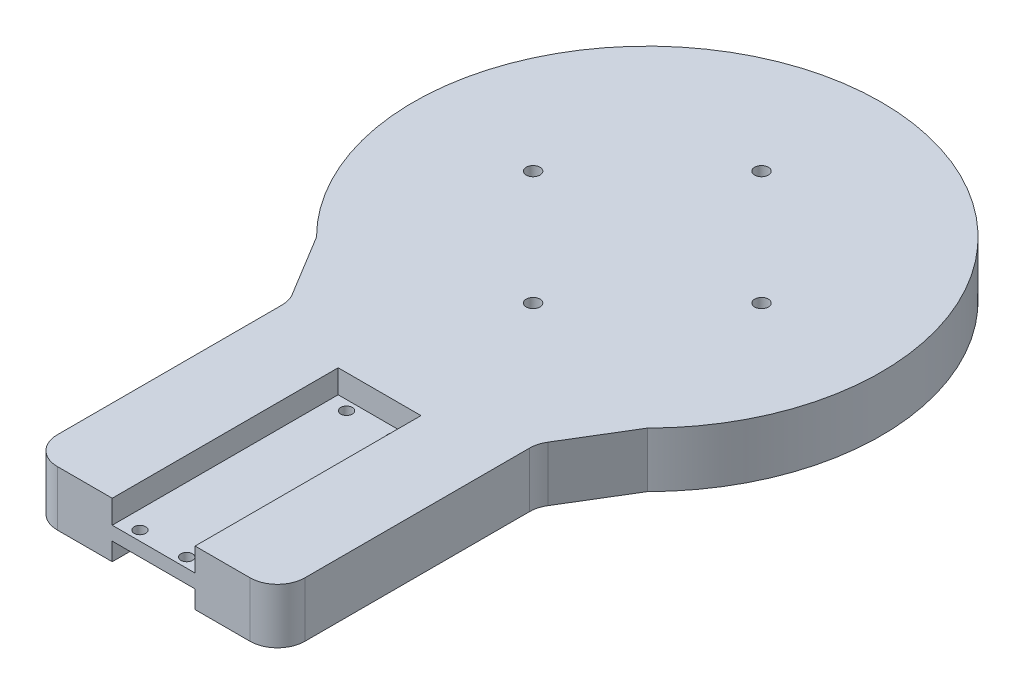
ISO-10303-21;
HEADER;
FILE_DESCRIPTION(('STEP AP214'),'2;1');
FILE_NAME('part.step','',(''),(''),'','','');
FILE_SCHEMA(('AUTOMOTIVE_DESIGN { 1 0 10303 214 1 1 1 1 }'));
ENDSEC;
DATA;
#1=APPLICATION_CONTEXT('core data for automotive mechanical design processes');
#2=APPLICATION_PROTOCOL_DEFINITION('international standard','automotive_design',2000,#1);
#3=PRODUCT_CONTEXT('',#1,'mechanical');
#4=PRODUCT('Part','Part','',(#3));
#5=PRODUCT_RELATED_PRODUCT_CATEGORY('part','',(#4));
#6=PRODUCT_DEFINITION_FORMATION('','',#4);
#7=PRODUCT_DEFINITION_CONTEXT('part definition',#1,'design');
#8=PRODUCT_DEFINITION('design','',#6,#7);
#9=PRODUCT_DEFINITION_SHAPE('','',#8);
#10=(LENGTH_UNIT() NAMED_UNIT(*) SI_UNIT(.MILLI.,.METRE.));
#11=(NAMED_UNIT(*) PLANE_ANGLE_UNIT() SI_UNIT($,.RADIAN.));
#12=(NAMED_UNIT(*) SI_UNIT($,.STERADIAN.) SOLID_ANGLE_UNIT());
#13=UNCERTAINTY_MEASURE_WITH_UNIT(LENGTH_MEASURE(1.E-05),#10,'distance_accuracy_value','');
#14=(GEOMETRIC_REPRESENTATION_CONTEXT(3) GLOBAL_UNCERTAINTY_ASSIGNED_CONTEXT((#13)) GLOBAL_UNIT_ASSIGNED_CONTEXT((#10,
#11,#12)) REPRESENTATION_CONTEXT('',''));
#15=CARTESIAN_POINT('',(0.,0.,0.));
#16=DIRECTION('',(0.,0.,1.));
#17=DIRECTION('',(1.,0.,0.));
#18=AXIS2_PLACEMENT_3D('',#15,#16,#17);
#19=CARTESIAN_POINT('',(35.,20.,169.39));
#20=DIRECTION('',(0.,1.,0.));
#21=DIRECTION('',(0.,0.,1.));
#22=AXIS2_PLACEMENT_3D('',#19,#20,#21);
#23=PLANE('',#22);
#24=DIRECTION('',(0.,0.,-1.));
#25=VECTOR('',#24,1.);
#26=CARTESIAN_POINT('',(15.05,20.,97.29));
#27=LINE('',#26,#25);
#28=CARTESIAN_POINT('',(15.05,20.,179.39));
#29=VERTEX_POINT('',#28);
#30=CARTESIAN_POINT('',(15.05,20.,97.29));
#31=VERTEX_POINT('',#30);
#32=EDGE_CURVE('E211',#29,#31,#27,.T.);
#33=ORIENTED_EDGE('',*,*,#32,.F.);
#34=DIRECTION('',(1.,0.,0.));
#35=VECTOR('',#34,1.);
#36=CARTESIAN_POINT('',(-34.9999999999999,20.,179.39));
#37=LINE('',#36,#35);
#38=CARTESIAN_POINT('',(34.9999999999999,20.,179.39));
#39=VERTEX_POINT('',#38);
#40=EDGE_CURVE('E315',#29,#39,#37,.T.);
#41=ORIENTED_EDGE('',*,*,#40,.T.);
#42=CARTESIAN_POINT('',(35.,20.,169.39));
#43=DIRECTION('',(0.,1.,0.));
#44=DIRECTION('',(0.,0.,1.));
#45=AXIS2_PLACEMENT_3D('',#42,#43,#44);
#46=CIRCLE('',#45,10.);
#47=CARTESIAN_POINT('',(45.,20.,169.39));
#48=VERTEX_POINT('',#47);
#49=EDGE_CURVE('E286',#39,#48,#46,.T.);
#50=ORIENTED_EDGE('',*,*,#49,.T.);
#51=DIRECTION('',(0.,0.,-1.));
#52=VECTOR('',#51,1.);
#53=CARTESIAN_POINT('',(45.,20.,169.39));
#54=LINE('',#53,#52);
#55=CARTESIAN_POINT('',(45.,20.,87.7962570863811));
#56=VERTEX_POINT('',#55);
#57=EDGE_CURVE('E290',#48,#56,#54,.T.);
#58=ORIENTED_EDGE('',*,*,#57,.T.);
#59=CARTESIAN_POINT('',(55.,20.,87.7962570863811));
#60=DIRECTION('',(0.,-1.,0.));
#61=DIRECTION('',(0.,0.,-1.));
#62=AXIS2_PLACEMENT_3D('',#59,#60,#61);
#63=CIRCLE('',#62,10.);
#64=CARTESIAN_POINT('',(46.4504029529679,20.,82.6093128671534));
#65=VERTEX_POINT('',#64);
#66=EDGE_CURVE('E294',#56,#65,#63,.T.);
#67=ORIENTED_EDGE('',*,*,#66,.T.);
#68=DIRECTION('',(0.518694421922767,0.,-0.854959704703214));
#69=VECTOR('',#68,1.);
#70=CARTESIAN_POINT('',(60.1040764008566,20.,60.1040764008565));
#71=LINE('',#70,#69);
#72=CARTESIAN_POINT('',(60.1040764008565,20.,60.1040764008565));
#73=VERTEX_POINT('',#72);
#74=EDGE_CURVE('E297',#65,#73,#71,.T.);
#75=ORIENTED_EDGE('',*,*,#74,.T.);
#76=CARTESIAN_POINT('',(0.,20.,0.));
#77=DIRECTION('',(0.,1.,0.));
#78=DIRECTION('',(0.,0.,1.));
#79=AXIS2_PLACEMENT_3D('',#76,#77,#78);
#80=CIRCLE('',#79,85.);
#81=CARTESIAN_POINT('',(-60.1040764008565,20.,60.1040764008565));
#82=VERTEX_POINT('',#81);
#83=EDGE_CURVE('E300',#73,#82,#80,.T.);
#84=ORIENTED_EDGE('',*,*,#83,.T.);
#85=DIRECTION('',(0.518694421922766,0.,0.854959704703215));
#86=VECTOR('',#85,1.);
#87=CARTESIAN_POINT('',(-60.1040764008565,20.,60.1040764008565));
#88=LINE('',#87,#86);
#89=CARTESIAN_POINT('',(-46.4504029529679,20.,82.6093128671534));
#90=VERTEX_POINT('',#89);
#91=EDGE_CURVE('E303',#82,#90,#88,.T.);
#92=ORIENTED_EDGE('',*,*,#91,.T.);
#93=CARTESIAN_POINT('',(-55.,20.,87.7962570863811));
#94=DIRECTION('',(0.,-1.,0.));
#95=DIRECTION('',(0.,0.,1.));
#96=AXIS2_PLACEMENT_3D('',#93,#94,#95);
#97=CIRCLE('',#96,10.);
#98=CARTESIAN_POINT('',(-45.,20.,87.7962570863811));
#99=VERTEX_POINT('',#98);
#100=EDGE_CURVE('E306',#90,#99,#97,.T.);
#101=ORIENTED_EDGE('',*,*,#100,.T.);
#102=DIRECTION('',(0.,0.,1.));
#103=VECTOR('',#102,1.);
#104=CARTESIAN_POINT('',(-45.,20.,87.7962570863811));
#105=LINE('',#104,#103);
#106=CARTESIAN_POINT('',(-45.,20.,169.39));
#107=VERTEX_POINT('',#106);
#108=EDGE_CURVE('E309',#99,#107,#105,.T.);
#109=ORIENTED_EDGE('',*,*,#108,.T.);
#110=CARTESIAN_POINT('',(-35.,20.,169.39));
#111=DIRECTION('',(0.,1.,0.));
#112=DIRECTION('',(0.,0.,1.));
#113=AXIS2_PLACEMENT_3D('',#110,#111,#112);
#114=CIRCLE('',#113,10.);
#115=CARTESIAN_POINT('',(-34.9999999999999,20.,179.39));
#116=VERTEX_POINT('',#115);
#117=EDGE_CURVE('E312',#107,#116,#114,.T.);
#118=ORIENTED_EDGE('',*,*,#117,.T.);
#119=CARTESIAN_POINT('',(-15.05,20.,179.39));
#120=VERTEX_POINT('',#119);
#121=EDGE_CURVE('E316',#116,#120,#37,.T.);
#122=ORIENTED_EDGE('',*,*,#121,.T.);
#123=DIRECTION('',(0.,0.,1.));
#124=VECTOR('',#123,1.);
#125=CARTESIAN_POINT('',(-15.05,20.,97.29));
#126=LINE('',#125,#124);
#127=CARTESIAN_POINT('',(-15.05,20.,97.29));
#128=VERTEX_POINT('',#127);
#129=EDGE_CURVE('E223',#128,#120,#126,.T.);
#130=ORIENTED_EDGE('',*,*,#129,.F.);
#131=DIRECTION('',(-1.,0.,0.));
#132=VECTOR('',#131,1.);
#133=CARTESIAN_POINT('',(-15.05,20.,97.29));
#134=LINE('',#133,#132);
#135=EDGE_CURVE('E235',#31,#128,#134,.T.);
#136=ORIENTED_EDGE('',*,*,#135,.F.);
#137=EDGE_LOOP('',(#33,#41,#50,#58,#67,#75,#84,#92,#101,#109,#118,#122,#130,#136));
#138=FACE_BOUND('',#137,.T.);
#139=CARTESIAN_POINT('',(2.35196016362844E-12,20.,41.5));
#140=DIRECTION('',(0.,1.,0.));
#141=DIRECTION('',(0.,0.,1.));
#142=AXIS2_PLACEMENT_3D('',#139,#140,#141);
#143=CIRCLE('',#142,2.50000000000253);
#144=CARTESIAN_POINT('',(2.35196016362844E-12,20.,44.0000000000025));
#145=VERTEX_POINT('',#144);
#146=EDGE_CURVE('E262',#145,#145,#143,.T.);
#147=ORIENTED_EDGE('',*,*,#146,.F.);
#148=EDGE_LOOP('',(#147));
#149=FACE_BOUND('',#148,.T.);
#150=CARTESIAN_POINT('',(0.,20.,-41.5));
#151=DIRECTION('',(0.,1.,0.));
#152=DIRECTION('',(0.,0.,1.));
#153=AXIS2_PLACEMENT_3D('',#150,#151,#152);
#154=CIRCLE('',#153,2.5);
#155=CARTESIAN_POINT('',(0.,20.,-39.));
#156=VERTEX_POINT('',#155);
#157=EDGE_CURVE('E278',#156,#156,#154,.T.);
#158=ORIENTED_EDGE('',*,*,#157,.F.);
#159=EDGE_LOOP('',(#158));
#160=FACE_BOUND('',#159,.T.);
#161=CARTESIAN_POINT('',(41.5000000000012,20.,-1.17598008181422E-12));
#162=DIRECTION('',(0.,1.,0.));
#163=DIRECTION('',(0.,0.,1.));
#164=AXIS2_PLACEMENT_3D('',#161,#162,#163);
#165=CIRCLE('',#164,2.50000000000092);
#166=CARTESIAN_POINT('',(41.5000000000012,20.,2.49999999999974));
#167=VERTEX_POINT('',#166);
#168=EDGE_CURVE('E270',#167,#167,#165,.T.);
#169=ORIENTED_EDGE('',*,*,#168,.F.);
#170=EDGE_LOOP('',(#169));
#171=FACE_BOUND('',#170,.T.);
#172=CARTESIAN_POINT('',(-41.4999999999988,20.,1.18106236603068E-12));
#173=DIRECTION('',(0.,1.,0.));
#174=DIRECTION('',(0.,0.,1.));
#175=AXIS2_PLACEMENT_3D('',#172,#173,#174);
#176=CIRCLE('',#175,2.50000000000189);
#177=CARTESIAN_POINT('',(-41.4999999999988,20.,2.50000000000307));
#178=VERTEX_POINT('',#177);
#179=EDGE_CURVE('E254',#178,#178,#176,.T.);
#180=ORIENTED_EDGE('',*,*,#179,.F.);
#181=EDGE_LOOP('',(#180));
#182=FACE_BOUND('',#181,.T.);
#183=ADVANCED_FACE('F39',(#138,#149,#160,#171,#182),#23,.T.);
#184=CARTESIAN_POINT('',(35.,0.,169.39));
#185=DIRECTION('',(0.,1.,0.));
#186=DIRECTION('',(0.,0.,1.));
#187=AXIS2_PLACEMENT_3D('',#184,#185,#186);
#188=PLANE('',#187);
#189=DIRECTION('',(1.,0.,0.));
#190=VECTOR('',#189,1.);
#191=CARTESIAN_POINT('',(-15.05,0.,97.29));
#192=LINE('',#191,#190);
#193=CARTESIAN_POINT('',(-15.05,0.,97.29));
#194=VERTEX_POINT('',#193);
#195=CARTESIAN_POINT('',(15.05,0.,97.29));
#196=VERTEX_POINT('',#195);
#197=EDGE_CURVE('E193',#194,#196,#192,.T.);
#198=ORIENTED_EDGE('',*,*,#197,.F.);
#199=DIRECTION('',(0.,0.,-1.));
#200=VECTOR('',#199,1.);
#201=CARTESIAN_POINT('',(-15.05,0.,179.39));
#202=LINE('',#201,#200);
#203=CARTESIAN_POINT('',(-15.05,0.,179.39));
#204=VERTEX_POINT('',#203);
#205=EDGE_CURVE('E174',#204,#194,#202,.T.);
#206=ORIENTED_EDGE('',*,*,#205,.F.);
#207=DIRECTION('',(1.,0.,0.));
#208=VECTOR('',#207,1.);
#209=CARTESIAN_POINT('',(-34.9999999999999,0.,179.39));
#210=LINE('',#209,#208);
#211=CARTESIAN_POINT('',(-34.9999999999999,0.,179.39));
#212=VERTEX_POINT('',#211);
#213=EDGE_CURVE('E291',#212,#204,#210,.T.);
#214=ORIENTED_EDGE('',*,*,#213,.F.);
#215=CARTESIAN_POINT('',(-35.,0.,169.39));
#216=DIRECTION('',(0.,1.,0.));
#217=DIRECTION('',(0.,0.,1.));
#218=AXIS2_PLACEMENT_3D('',#215,#216,#217);
#219=CIRCLE('',#218,10.);
#220=CARTESIAN_POINT('',(-45.,0.,169.39));
#221=VERTEX_POINT('',#220);
#222=EDGE_CURVE('E346',#221,#212,#219,.T.);
#223=ORIENTED_EDGE('',*,*,#222,.F.);
#224=DIRECTION('',(0.,0.,1.));
#225=VECTOR('',#224,1.);
#226=CARTESIAN_POINT('',(-45.,0.,118.89));
#227=LINE('',#226,#225);
#228=CARTESIAN_POINT('',(-45.,0.,87.7962570863811));
#229=VERTEX_POINT('',#228);
#230=EDGE_CURVE('E343',#229,#221,#227,.T.);
#231=ORIENTED_EDGE('',*,*,#230,.F.);
#232=CARTESIAN_POINT('',(-55.,0.,87.7962570863811));
#233=DIRECTION('',(0.,-1.,0.));
#234=DIRECTION('',(0.,0.,1.));
#235=AXIS2_PLACEMENT_3D('',#232,#233,#234);
#236=CIRCLE('',#235,10.);
#237=CARTESIAN_POINT('',(-46.4504029529679,0.,82.6093128671534));
#238=VERTEX_POINT('',#237);
#239=EDGE_CURVE('E339',#238,#229,#236,.T.);
#240=ORIENTED_EDGE('',*,*,#239,.F.);
#241=DIRECTION('',(0.518694421922766,0.,0.854959704703215));
#242=VECTOR('',#241,1.);
#243=CARTESIAN_POINT('',(-60.1040764008565,0.,60.1040764008565));
#244=LINE('',#243,#242);
#245=CARTESIAN_POINT('',(-60.1040764008565,0.,60.1040764008565));
#246=VERTEX_POINT('',#245);
#247=EDGE_CURVE('E336',#246,#238,#244,.T.);
#248=ORIENTED_EDGE('',*,*,#247,.F.);
#249=CARTESIAN_POINT('',(0.,0.,0.));
#250=DIRECTION('',(0.,1.,0.));
#251=DIRECTION('',(0.,0.,1.));
#252=AXIS2_PLACEMENT_3D('',#249,#250,#251);
#253=CIRCLE('',#252,85.);
#254=CARTESIAN_POINT('',(60.1040764008565,0.,60.1040764008565));
#255=VERTEX_POINT('',#254);
#256=EDGE_CURVE('E333',#255,#246,#253,.T.);
#257=ORIENTED_EDGE('',*,*,#256,.F.);
#258=DIRECTION('',(0.518694421922767,0.,-0.854959704703214));
#259=VECTOR('',#258,1.);
#260=CARTESIAN_POINT('',(60.1040764008566,0.,60.1040764008565));
#261=LINE('',#260,#259);
#262=CARTESIAN_POINT('',(46.4504029529679,0.,82.6093128671534));
#263=VERTEX_POINT('',#262);
#264=EDGE_CURVE('E330',#263,#255,#261,.T.);
#265=ORIENTED_EDGE('',*,*,#264,.F.);
#266=CARTESIAN_POINT('',(55.,0.,87.7962570863811));
#267=DIRECTION('',(0.,-1.,0.));
#268=DIRECTION('',(0.,0.,-1.));
#269=AXIS2_PLACEMENT_3D('',#266,#267,#268);
#270=CIRCLE('',#269,10.);
#271=CARTESIAN_POINT('',(45.,0.,87.7962570863811));
#272=VERTEX_POINT('',#271);
#273=EDGE_CURVE('E327',#272,#263,#270,.T.);
#274=ORIENTED_EDGE('',*,*,#273,.F.);
#275=DIRECTION('',(0.,0.,-1.));
#276=VECTOR('',#275,1.);
#277=CARTESIAN_POINT('',(45.,0.,87.7962570863811));
#278=LINE('',#277,#276);
#279=CARTESIAN_POINT('',(45.,0.,169.39));
#280=VERTEX_POINT('',#279);
#281=EDGE_CURVE('E324',#280,#272,#278,.T.);
#282=ORIENTED_EDGE('',*,*,#281,.F.);
#283=CARTESIAN_POINT('',(35.,0.,169.39));
#284=DIRECTION('',(0.,1.,0.));
#285=DIRECTION('',(0.,0.,1.));
#286=AXIS2_PLACEMENT_3D('',#283,#284,#285);
#287=CIRCLE('',#286,10.);
#288=CARTESIAN_POINT('',(34.9999999999999,0.,179.39));
#289=VERTEX_POINT('',#288);
#290=EDGE_CURVE('E282',#289,#280,#287,.T.);
#291=ORIENTED_EDGE('',*,*,#290,.F.);
#292=CARTESIAN_POINT('',(15.05,0.,179.39));
#293=VERTEX_POINT('',#292);
#294=EDGE_CURVE('E349',#293,#289,#210,.T.);
#295=ORIENTED_EDGE('',*,*,#294,.F.);
#296=DIRECTION('',(0.,0.,1.));
#297=VECTOR('',#296,1.);
#298=CARTESIAN_POINT('',(15.05,0.,97.29));
#299=LINE('',#298,#297);
#300=EDGE_CURVE('E190',#196,#293,#299,.T.);
#301=ORIENTED_EDGE('',*,*,#300,.F.);
#302=EDGE_LOOP('',(#198,#206,#214,#223,#231,#240,#248,#257,#265,#274,#282,#291,#295,#301));
#303=FACE_BOUND('',#302,.T.);
#304=CARTESIAN_POINT('',(0.,0.,-41.5));
#305=DIRECTION('',(0.,1.,0.));
#306=DIRECTION('',(0.,0.,1.));
#307=AXIS2_PLACEMENT_3D('',#304,#305,#306);
#308=CIRCLE('',#307,2.5);
#309=CARTESIAN_POINT('',(0.,0.,-39.));
#310=VERTEX_POINT('',#309);
#311=EDGE_CURVE('E274',#310,#310,#308,.T.);
#312=ORIENTED_EDGE('',*,*,#311,.T.);
#313=EDGE_LOOP('',(#312));
#314=FACE_BOUND('',#313,.T.);
#315=CARTESIAN_POINT('',(41.5000000000012,0.,-1.17598008181422E-12));
#316=DIRECTION('',(0.,1.,0.));
#317=DIRECTION('',(0.,0.,1.));
#318=AXIS2_PLACEMENT_3D('',#315,#316,#317);
#319=CIRCLE('',#318,2.50000000000092);
#320=CARTESIAN_POINT('',(41.5000000000012,0.,2.49999999999974));
#321=VERTEX_POINT('',#320);
#322=EDGE_CURVE('E266',#321,#321,#319,.T.);
#323=ORIENTED_EDGE('',*,*,#322,.T.);
#324=EDGE_LOOP('',(#323));
#325=FACE_BOUND('',#324,.T.);
#326=CARTESIAN_POINT('',(2.35196016362844E-12,0.,41.5));
#327=DIRECTION('',(0.,1.,0.));
#328=DIRECTION('',(0.,0.,1.));
#329=AXIS2_PLACEMENT_3D('',#326,#327,#328);
#330=CIRCLE('',#329,2.50000000000253);
#331=CARTESIAN_POINT('',(2.35196016362844E-12,0.,44.0000000000025));
#332=VERTEX_POINT('',#331);
#333=EDGE_CURVE('E258',#332,#332,#330,.T.);
#334=ORIENTED_EDGE('',*,*,#333,.T.);
#335=EDGE_LOOP('',(#334));
#336=FACE_BOUND('',#335,.T.);
#337=CARTESIAN_POINT('',(-41.4999999999988,0.,1.18106236603068E-12));
#338=DIRECTION('',(0.,1.,0.));
#339=DIRECTION('',(0.,0.,1.));
#340=AXIS2_PLACEMENT_3D('',#337,#338,#339);
#341=CIRCLE('',#340,2.50000000000189);
#342=CARTESIAN_POINT('',(-41.4999999999988,0.,2.50000000000307));
#343=VERTEX_POINT('',#342);
#344=EDGE_CURVE('E244',#343,#343,#341,.T.);
#345=ORIENTED_EDGE('',*,*,#344,.T.);
#346=EDGE_LOOP('',(#345));
#347=FACE_BOUND('',#346,.T.);
#348=ADVANCED_FACE('F394',(#303,#314,#325,#336,#347),#188,.F.);
#349=CARTESIAN_POINT('',(35.,20.,169.39));
#350=DIRECTION('',(0.,-1.,0.));
#351=DIRECTION('',(0.,0.,-1.));
#352=AXIS2_PLACEMENT_3D('',#349,#350,#351);
#353=CYLINDRICAL_SURFACE('',#352,10.);
#354=ORIENTED_EDGE('',*,*,#290,.T.);
#355=DIRECTION('',(0.,-1.,0.));
#356=VECTOR('',#355,1.);
#357=CARTESIAN_POINT('',(45.,20.,169.39));
#358=LINE('',#357,#356);
#359=EDGE_CURVE('E11',#48,#280,#358,.T.);
#360=ORIENTED_EDGE('',*,*,#359,.F.);
#361=ORIENTED_EDGE('',*,*,#49,.F.);
#362=DIRECTION('',(0.,-1.,0.));
#363=VECTOR('',#362,1.);
#364=CARTESIAN_POINT('',(34.9999999999999,20.,179.39));
#365=LINE('',#364,#363);
#366=EDGE_CURVE('E320',#39,#289,#365,.T.);
#367=ORIENTED_EDGE('',*,*,#366,.T.);
#368=EDGE_LOOP('',(#354,#360,#361,#367));
#369=FACE_BOUND('',#368,.T.);
#370=ADVANCED_FACE('F41',(#369),#353,.T.);
#371=CARTESIAN_POINT('',(45.,20.,87.7962570863811));
#372=DIRECTION('',(-1.,0.,0.));
#373=DIRECTION('',(0.,0.,1.));
#374=AXIS2_PLACEMENT_3D('',#371,#372,#373);
#375=PLANE('',#374);
#376=ORIENTED_EDGE('',*,*,#281,.T.);
#377=DIRECTION('',(0.,-1.,0.));
#378=VECTOR('',#377,1.);
#379=CARTESIAN_POINT('',(45.,20.,87.7962570863811));
#380=LINE('',#379,#378);
#381=EDGE_CURVE('E48',#56,#272,#380,.T.);
#382=ORIENTED_EDGE('',*,*,#381,.F.);
#383=ORIENTED_EDGE('',*,*,#57,.F.);
#384=ORIENTED_EDGE('',*,*,#359,.T.);
#385=EDGE_LOOP('',(#376,#382,#383,#384));
#386=FACE_BOUND('',#385,.T.);
#387=ADVANCED_FACE('F414',(#386),#375,.F.);
#388=CARTESIAN_POINT('',(55.,20.,87.7962570863811));
#389=DIRECTION('',(0.,-1.,0.));
#390=DIRECTION('',(0.,0.,-1.));
#391=AXIS2_PLACEMENT_3D('',#388,#389,#390);
#392=CYLINDRICAL_SURFACE('',#391,10.);
#393=ORIENTED_EDGE('',*,*,#273,.T.);
#394=DIRECTION('',(0.,-1.,0.));
#395=VECTOR('',#394,1.);
#396=CARTESIAN_POINT('',(46.4504029529679,20.,82.6093128671534));
#397=LINE('',#396,#395);
#398=EDGE_CURVE('E380',#65,#263,#397,.T.);
#399=ORIENTED_EDGE('',*,*,#398,.F.);
#400=ORIENTED_EDGE('',*,*,#66,.F.);
#401=ORIENTED_EDGE('',*,*,#381,.T.);
#402=EDGE_LOOP('',(#393,#399,#400,#401));
#403=FACE_BOUND('',#402,.T.);
#404=ADVANCED_FACE('F389',(#403),#392,.F.);
#405=CARTESIAN_POINT('',(60.1040764008566,20.,60.1040764008565));
#406=DIRECTION('',(-0.854959704703214,0.,-0.518694421922767));
#407=DIRECTION('',(-0.518694421922767,0.,0.854959704703214));
#408=AXIS2_PLACEMENT_3D('',#405,#406,#407);
#409=PLANE('',#408);
#410=ORIENTED_EDGE('',*,*,#264,.T.);
#411=DIRECTION('',(0.,-1.,0.));
#412=VECTOR('',#411,1.);
#413=CARTESIAN_POINT('',(60.1040764008565,20.,60.1040764008565));
#414=LINE('',#413,#412);
#415=EDGE_CURVE('E376',#73,#255,#414,.T.);
#416=ORIENTED_EDGE('',*,*,#415,.F.);
#417=ORIENTED_EDGE('',*,*,#74,.F.);
#418=ORIENTED_EDGE('',*,*,#398,.T.);
#419=EDGE_LOOP('',(#410,#416,#417,#418));
#420=FACE_BOUND('',#419,.T.);
#421=ADVANCED_FACE('F401',(#420),#409,.F.);
#422=CARTESIAN_POINT('',(0.,20.,0.));
#423=DIRECTION('',(0.,-1.,0.));
#424=DIRECTION('',(0.,0.,-1.));
#425=AXIS2_PLACEMENT_3D('',#422,#423,#424);
#426=CYLINDRICAL_SURFACE('',#425,85.);
#427=ORIENTED_EDGE('',*,*,#256,.T.);
#428=DIRECTION('',(0.,-1.,0.));
#429=VECTOR('',#428,1.);
#430=CARTESIAN_POINT('',(-60.1040764008565,20.,60.1040764008565));
#431=LINE('',#430,#429);
#432=EDGE_CURVE('E372',#82,#246,#431,.T.);
#433=ORIENTED_EDGE('',*,*,#432,.F.);
#434=ORIENTED_EDGE('',*,*,#83,.F.);
#435=ORIENTED_EDGE('',*,*,#415,.T.);
#436=EDGE_LOOP('',(#427,#433,#434,#435));
#437=FACE_BOUND('',#436,.T.);
#438=ADVANCED_FACE('F405',(#437),#426,.T.);
#439=CARTESIAN_POINT('',(-60.1040764008565,20.,60.1040764008565));
#440=DIRECTION('',(0.854959704703215,0.,-0.518694421922766));
#441=DIRECTION('',(-0.518694421922766,0.,-0.854959704703215));
#442=AXIS2_PLACEMENT_3D('',#439,#440,#441);
#443=PLANE('',#442);
#444=ORIENTED_EDGE('',*,*,#247,.T.);
#445=DIRECTION('',(0.,-1.,0.));
#446=VECTOR('',#445,1.);
#447=CARTESIAN_POINT('',(-46.4504029529679,20.,82.6093128671534));
#448=LINE('',#447,#446);
#449=EDGE_CURVE('E368',#90,#238,#448,.T.);
#450=ORIENTED_EDGE('',*,*,#449,.F.);
#451=ORIENTED_EDGE('',*,*,#91,.F.);
#452=ORIENTED_EDGE('',*,*,#432,.T.);
#453=EDGE_LOOP('',(#444,#450,#451,#452));
#454=FACE_BOUND('',#453,.T.);
#455=ADVANCED_FACE('F558',(#454),#443,.F.);
#456=CARTESIAN_POINT('',(-55.,20.,87.7962570863811));
#457=DIRECTION('',(0.,-1.,0.));
#458=DIRECTION('',(0.,0.,-1.));
#459=AXIS2_PLACEMENT_3D('',#456,#457,#458);
#460=CYLINDRICAL_SURFACE('',#459,10.);
#461=ORIENTED_EDGE('',*,*,#239,.T.);
#462=DIRECTION('',(0.,-1.,0.));
#463=VECTOR('',#462,1.);
#464=CARTESIAN_POINT('',(-45.,20.,87.7962570863811));
#465=LINE('',#464,#463);
#466=EDGE_CURVE('E364',#99,#229,#465,.T.);
#467=ORIENTED_EDGE('',*,*,#466,.F.);
#468=ORIENTED_EDGE('',*,*,#100,.F.);
#469=ORIENTED_EDGE('',*,*,#449,.T.);
#470=EDGE_LOOP('',(#461,#467,#468,#469));
#471=FACE_BOUND('',#470,.T.);
#472=ADVANCED_FACE('F551',(#471),#460,.F.);
#473=CARTESIAN_POINT('',(-45.,20.,118.89));
#474=DIRECTION('',(1.,0.,0.));
#475=DIRECTION('',(0.,0.,-1.));
#476=AXIS2_PLACEMENT_3D('',#473,#474,#475);
#477=PLANE('',#476);
#478=ORIENTED_EDGE('',*,*,#230,.T.);
#479=DIRECTION('',(0.,-1.,0.));
#480=VECTOR('',#479,1.);
#481=CARTESIAN_POINT('',(-45.,20.,169.39));
#482=LINE('',#481,#480);
#483=EDGE_CURVE('E360',#107,#221,#482,.T.);
#484=ORIENTED_EDGE('',*,*,#483,.F.);
#485=ORIENTED_EDGE('',*,*,#108,.F.);
#486=ORIENTED_EDGE('',*,*,#466,.T.);
#487=EDGE_LOOP('',(#478,#484,#485,#486));
#488=FACE_BOUND('',#487,.T.);
#489=ADVANCED_FACE('F438',(#488),#477,.F.);
#490=CARTESIAN_POINT('',(-35.,20.,169.39));
#491=DIRECTION('',(0.,-1.,0.));
#492=DIRECTION('',(0.,0.,-1.));
#493=AXIS2_PLACEMENT_3D('',#490,#491,#492);
#494=CYLINDRICAL_SURFACE('',#493,10.);
#495=ORIENTED_EDGE('',*,*,#222,.T.);
#496=DIRECTION('',(0.,-1.,0.));
#497=VECTOR('',#496,1.);
#498=CARTESIAN_POINT('',(-34.9999999999999,20.,179.39));
#499=LINE('',#498,#497);
#500=EDGE_CURVE('E356',#116,#212,#499,.T.);
#501=ORIENTED_EDGE('',*,*,#500,.F.);
#502=ORIENTED_EDGE('',*,*,#117,.F.);
#503=ORIENTED_EDGE('',*,*,#483,.T.);
#504=EDGE_LOOP('',(#495,#501,#502,#503));
#505=FACE_BOUND('',#504,.T.);
#506=ADVANCED_FACE('F429',(#505),#494,.T.);
#507=CARTESIAN_POINT('',(-34.9999999999999,20.,179.39));
#508=DIRECTION('',(0.,0.,-1.));
#509=DIRECTION('',(-1.,0.,0.));
#510=AXIS2_PLACEMENT_3D('',#507,#508,#509);
#511=PLANE('',#510);
#512=ORIENTED_EDGE('',*,*,#213,.T.);
#513=DIRECTION('',(0.,-1.,0.));
#514=VECTOR('',#513,1.);
#515=CARTESIAN_POINT('',(-15.05,6.5,179.39));
#516=LINE('',#515,#514);
#517=CARTESIAN_POINT('',(-15.05,6.5,179.39));
#518=VERTEX_POINT('',#517);
#519=EDGE_CURVE('E208',#518,#204,#516,.T.);
#520=ORIENTED_EDGE('',*,*,#519,.F.);
#521=DIRECTION('',(-1.,0.,0.));
#522=VECTOR('',#521,1.);
#523=CARTESIAN_POINT('',(15.05,6.5,179.39));
#524=LINE('',#523,#522);
#525=CARTESIAN_POINT('',(15.05,6.5,179.39));
#526=VERTEX_POINT('',#525);
#527=EDGE_CURVE('E180',#526,#518,#524,.T.);
#528=ORIENTED_EDGE('',*,*,#527,.F.);
#529=DIRECTION('',(0.,-1.,0.));
#530=VECTOR('',#529,1.);
#531=CARTESIAN_POINT('',(15.05,6.5,179.39));
#532=LINE('',#531,#530);
#533=EDGE_CURVE('E212',#526,#293,#532,.T.);
#534=ORIENTED_EDGE('',*,*,#533,.T.);
#535=ORIENTED_EDGE('',*,*,#294,.T.);
#536=ORIENTED_EDGE('',*,*,#366,.F.);
#537=ORIENTED_EDGE('',*,*,#40,.F.);
#538=DIRECTION('',(0.,1.,0.));
#539=VECTOR('',#538,1.);
#540=CARTESIAN_POINT('',(15.05,11.5,179.39));
#541=LINE('',#540,#539);
#542=CARTESIAN_POINT('',(15.05,11.5,179.39));
#543=VERTEX_POINT('',#542);
#544=EDGE_CURVE('E241',#543,#29,#541,.T.);
#545=ORIENTED_EDGE('',*,*,#544,.F.);
#546=DIRECTION('',(1.,0.,0.));
#547=VECTOR('',#546,1.);
#548=CARTESIAN_POINT('',(-15.05,11.5,179.39));
#549=LINE('',#548,#547);
#550=CARTESIAN_POINT('',(-15.05,11.5,179.39));
#551=VERTEX_POINT('',#550);
#552=EDGE_CURVE('E228',#551,#543,#549,.T.);
#553=ORIENTED_EDGE('',*,*,#552,.F.);
#554=DIRECTION('',(0.,1.,0.));
#555=VECTOR('',#554,1.);
#556=CARTESIAN_POINT('',(-15.05,11.5,179.39));
#557=LINE('',#556,#555);
#558=EDGE_CURVE('E245',#551,#120,#557,.T.);
#559=ORIENTED_EDGE('',*,*,#558,.T.);
#560=ORIENTED_EDGE('',*,*,#121,.F.);
#561=ORIENTED_EDGE('',*,*,#500,.T.);
#562=EDGE_LOOP('',(#512,#520,#528,#534,#535,#536,#537,#545,#553,#559,#560,#561));
#563=FACE_BOUND('',#562,.T.);
#564=ADVANCED_FACE('F425',(#563),#511,.F.);
#565=CARTESIAN_POINT('',(0.,20.,-41.5));
#566=DIRECTION('',(0.,-1.,0.));
#567=DIRECTION('',(0.,0.,-1.));
#568=AXIS2_PLACEMENT_3D('',#565,#566,#567);
#569=CYLINDRICAL_SURFACE('',#568,2.5);
#570=ORIENTED_EDGE('',*,*,#157,.T.);
#571=EDGE_LOOP('',(#570));
#572=FACE_BOUND('',#571,.T.);
#573=ORIENTED_EDGE('',*,*,#311,.F.);
#574=EDGE_LOOP('',(#573));
#575=FACE_BOUND('',#574,.T.);
#576=ADVANCED_FACE('F428',(#572,#575),#569,.F.);
#577=CARTESIAN_POINT('',(41.5000000000012,20.,-1.17598008181422E-12));
#578=DIRECTION('',(0.,-1.,0.));
#579=DIRECTION('',(0.,0.,-1.));
#580=AXIS2_PLACEMENT_3D('',#577,#578,#579);
#581=CYLINDRICAL_SURFACE('',#580,2.50000000000092);
#582=ORIENTED_EDGE('',*,*,#168,.T.);
#583=EDGE_LOOP('',(#582));
#584=FACE_BOUND('',#583,.T.);
#585=ORIENTED_EDGE('',*,*,#322,.F.);
#586=EDGE_LOOP('',(#585));
#587=FACE_BOUND('',#586,.T.);
#588=ADVANCED_FACE('F435',(#584,#587),#581,.F.);
#589=CARTESIAN_POINT('',(2.35196016362844E-12,20.,41.5));
#590=DIRECTION('',(0.,-1.,0.));
#591=DIRECTION('',(0.,0.,-1.));
#592=AXIS2_PLACEMENT_3D('',#589,#590,#591);
#593=CYLINDRICAL_SURFACE('',#592,2.50000000000253);
#594=ORIENTED_EDGE('',*,*,#146,.T.);
#595=EDGE_LOOP('',(#594));
#596=FACE_BOUND('',#595,.T.);
#597=ORIENTED_EDGE('',*,*,#333,.F.);
#598=EDGE_LOOP('',(#597));
#599=FACE_BOUND('',#598,.T.);
#600=ADVANCED_FACE('F450',(#596,#599),#593,.F.);
#601=CARTESIAN_POINT('',(-41.4999999999988,20.,1.18106236603068E-12));
#602=DIRECTION('',(0.,-1.,0.));
#603=DIRECTION('',(0.,0.,-1.));
#604=AXIS2_PLACEMENT_3D('',#601,#602,#603);
#605=CYLINDRICAL_SURFACE('',#604,2.50000000000189);
#606=ORIENTED_EDGE('',*,*,#179,.T.);
#607=EDGE_LOOP('',(#606));
#608=FACE_BOUND('',#607,.T.);
#609=ORIENTED_EDGE('',*,*,#344,.F.);
#610=EDGE_LOOP('',(#609));
#611=FACE_BOUND('',#610,.T.);
#612=ADVANCED_FACE('F454',(#608,#611),#605,.F.);
#613=CARTESIAN_POINT('',(15.05,11.5,97.29));
#614=DIRECTION('',(1.,0.,0.));
#615=DIRECTION('',(0.,0.,-1.));
#616=AXIS2_PLACEMENT_3D('',#613,#614,#615);
#617=PLANE('',#616);
#618=ORIENTED_EDGE('',*,*,#32,.T.);
#619=DIRECTION('',(0.,1.,0.));
#620=VECTOR('',#619,1.);
#621=CARTESIAN_POINT('',(15.05,11.5,97.29));
#622=LINE('',#621,#620);
#623=CARTESIAN_POINT('',(15.05,11.5,97.29));
#624=VERTEX_POINT('',#623);
#625=EDGE_CURVE('E231',#624,#31,#622,.T.);
#626=ORIENTED_EDGE('',*,*,#625,.F.);
#627=DIRECTION('',(0.,0.,-1.));
#628=VECTOR('',#627,1.);
#629=CARTESIAN_POINT('',(15.05,11.5,97.29));
#630=LINE('',#629,#628);
#631=EDGE_CURVE('E218',#543,#624,#630,.T.);
#632=ORIENTED_EDGE('',*,*,#631,.F.);
#633=ORIENTED_EDGE('',*,*,#544,.T.);
#634=EDGE_LOOP('',(#618,#626,#632,#633));
#635=FACE_BOUND('',#634,.T.);
#636=ADVANCED_FACE('F458',(#635),#617,.F.);
#637=CARTESIAN_POINT('',(-15.05,11.5,97.29));
#638=DIRECTION('',(-1.,0.,0.));
#639=DIRECTION('',(0.,0.,1.));
#640=AXIS2_PLACEMENT_3D('',#637,#638,#639);
#641=PLANE('',#640);
#642=ORIENTED_EDGE('',*,*,#129,.T.);
#643=ORIENTED_EDGE('',*,*,#558,.F.);
#644=DIRECTION('',(0.,0.,1.));
#645=VECTOR('',#644,1.);
#646=CARTESIAN_POINT('',(-15.05,11.5,97.29));
#647=LINE('',#646,#645);
#648=CARTESIAN_POINT('',(-15.05,11.5,97.29));
#649=VERTEX_POINT('',#648);
#650=EDGE_CURVE('E63',#649,#551,#647,.T.);
#651=ORIENTED_EDGE('',*,*,#650,.F.);
#652=DIRECTION('',(0.,1.,0.));
#653=VECTOR('',#652,1.);
#654=CARTESIAN_POINT('',(-15.05,11.5,97.29));
#655=LINE('',#654,#653);
#656=EDGE_CURVE('E249',#649,#128,#655,.T.);
#657=ORIENTED_EDGE('',*,*,#656,.T.);
#658=EDGE_LOOP('',(#642,#643,#651,#657));
#659=FACE_BOUND('',#658,.T.);
#660=ADVANCED_FACE('F462',(#659),#641,.F.);
#661=CARTESIAN_POINT('',(-15.05,11.5,97.29));
#662=DIRECTION('',(0.,0.,-1.));
#663=DIRECTION('',(-1.,0.,0.));
#664=AXIS2_PLACEMENT_3D('',#661,#662,#663);
#665=PLANE('',#664);
#666=ORIENTED_EDGE('',*,*,#135,.T.);
#667=ORIENTED_EDGE('',*,*,#656,.F.);
#668=DIRECTION('',(-1.,0.,0.));
#669=VECTOR('',#668,1.);
#670=CARTESIAN_POINT('',(-15.05,11.5,97.29));
#671=LINE('',#670,#669);
#672=EDGE_CURVE('E222',#624,#649,#671,.T.);
#673=ORIENTED_EDGE('',*,*,#672,.F.);
#674=ORIENTED_EDGE('',*,*,#625,.T.);
#675=EDGE_LOOP('',(#666,#667,#673,#674));
#676=FACE_BOUND('',#675,.T.);
#677=ADVANCED_FACE('F464',(#676),#665,.F.);
#678=CARTESIAN_POINT('',(0.,11.5,0.));
#679=DIRECTION('',(0.,1.,0.));
#680=DIRECTION('',(0.,0.,1.));
#681=AXIS2_PLACEMENT_3D('',#678,#679,#680);
#682=PLANE('',#681);
#683=CARTESIAN_POINT('',(-8.5,11.5,175.88));
#684=DIRECTION('',(0.,1.,0.));
#685=DIRECTION('',(0.,0.,-1.));
#686=AXIS2_PLACEMENT_3D('',#683,#684,#685);
#687=CIRCLE('',#686,2.1);
#688=CARTESIAN_POINT('',(-8.5,11.5,173.78));
#689=VERTEX_POINT('',#688);
#690=EDGE_CURVE('E526',#689,#689,#687,.T.);
#691=ORIENTED_EDGE('',*,*,#690,.F.);
#692=EDGE_LOOP('',(#691));
#693=FACE_BOUND('',#692,.T.);
#694=CARTESIAN_POINT('',(8.5,11.5,175.88));
#695=DIRECTION('',(0.,1.,0.));
#696=DIRECTION('',(0.,0.,-1.));
#697=AXIS2_PLACEMENT_3D('',#694,#695,#696);
#698=CIRCLE('',#697,2.1);
#699=CARTESIAN_POINT('',(8.5,11.5,173.78));
#700=VERTEX_POINT('',#699);
#701=EDGE_CURVE('E516',#700,#700,#698,.T.);
#702=ORIENTED_EDGE('',*,*,#701,.F.);
#703=EDGE_LOOP('',(#702));
#704=FACE_BOUND('',#703,.T.);
#705=CARTESIAN_POINT('',(8.5,11.5,100.8));
#706=DIRECTION('',(0.,1.,0.));
#707=DIRECTION('',(0.,0.,1.));
#708=AXIS2_PLACEMENT_3D('',#705,#706,#707);
#709=CIRCLE('',#708,2.1);
#710=CARTESIAN_POINT('',(8.5,11.5,102.9));
#711=VERTEX_POINT('',#710);
#712=EDGE_CURVE('E509',#711,#711,#709,.T.);
#713=ORIENTED_EDGE('',*,*,#712,.F.);
#714=EDGE_LOOP('',(#713));
#715=FACE_BOUND('',#714,.T.);
#716=CARTESIAN_POINT('',(-8.5,11.5,100.8));
#717=DIRECTION('',(0.,1.,0.));
#718=DIRECTION('',(0.,0.,1.));
#719=AXIS2_PLACEMENT_3D('',#716,#717,#718);
#720=CIRCLE('',#719,2.1);
#721=CARTESIAN_POINT('',(-8.5,11.5,102.9));
#722=VERTEX_POINT('',#721);
#723=EDGE_CURVE('E205',#722,#722,#720,.T.);
#724=ORIENTED_EDGE('',*,*,#723,.F.);
#725=EDGE_LOOP('',(#724));
#726=FACE_BOUND('',#725,.T.);
#727=ORIENTED_EDGE('',*,*,#631,.T.);
#728=ORIENTED_EDGE('',*,*,#672,.T.);
#729=ORIENTED_EDGE('',*,*,#650,.T.);
#730=ORIENTED_EDGE('',*,*,#552,.T.);
#731=EDGE_LOOP('',(#727,#728,#729,#730));
#732=FACE_BOUND('',#731,.T.);
#733=ADVANCED_FACE('F467',(#693,#704,#715,#726,#732),#682,.T.);
#734=CARTESIAN_POINT('',(-15.05,6.5,179.39));
#735=DIRECTION('',(-1.,0.,0.));
#736=DIRECTION('',(0.,0.,1.));
#737=AXIS2_PLACEMENT_3D('',#734,#735,#736);
#738=PLANE('',#737);
#739=ORIENTED_EDGE('',*,*,#205,.T.);
#740=DIRECTION('',(0.,-1.,0.));
#741=VECTOR('',#740,1.);
#742=CARTESIAN_POINT('',(-15.05,6.5,97.29));
#743=LINE('',#742,#741);
#744=CARTESIAN_POINT('',(-15.05,6.5,97.29));
#745=VERTEX_POINT('',#744);
#746=EDGE_CURVE('E168',#745,#194,#743,.T.);
#747=ORIENTED_EDGE('',*,*,#746,.F.);
#748=DIRECTION('',(0.,0.,-1.));
#749=VECTOR('',#748,1.);
#750=CARTESIAN_POINT('',(-15.05,6.5,179.39));
#751=LINE('',#750,#749);
#752=EDGE_CURVE('E172',#518,#745,#751,.T.);
#753=ORIENTED_EDGE('',*,*,#752,.F.);
#754=ORIENTED_EDGE('',*,*,#519,.T.);
#755=EDGE_LOOP('',(#739,#747,#753,#754));
#756=FACE_BOUND('',#755,.T.);
#757=ADVANCED_FACE('F170',(#756),#738,.F.);
#758=CARTESIAN_POINT('',(15.05,6.5,97.29));
#759=DIRECTION('',(1.,0.,0.));
#760=DIRECTION('',(0.,0.,-1.));
#761=AXIS2_PLACEMENT_3D('',#758,#759,#760);
#762=PLANE('',#761);
#763=ORIENTED_EDGE('',*,*,#300,.T.);
#764=ORIENTED_EDGE('',*,*,#533,.F.);
#765=DIRECTION('',(0.,0.,1.));
#766=VECTOR('',#765,1.);
#767=CARTESIAN_POINT('',(15.05,6.5,97.29));
#768=LINE('',#767,#766);
#769=CARTESIAN_POINT('',(15.05,6.5,97.29));
#770=VERTEX_POINT('',#769);
#771=EDGE_CURVE('E55',#770,#526,#768,.T.);
#772=ORIENTED_EDGE('',*,*,#771,.F.);
#773=DIRECTION('',(0.,-1.,0.));
#774=VECTOR('',#773,1.);
#775=CARTESIAN_POINT('',(15.05,6.5,97.29));
#776=LINE('',#775,#774);
#777=EDGE_CURVE('E179',#770,#196,#776,.T.);
#778=ORIENTED_EDGE('',*,*,#777,.T.);
#779=EDGE_LOOP('',(#763,#764,#772,#778));
#780=FACE_BOUND('',#779,.T.);
#781=ADVANCED_FACE('F477',(#780),#762,.F.);
#782=CARTESIAN_POINT('',(-15.05,6.5,97.29));
#783=DIRECTION('',(0.,0.,-1.));
#784=DIRECTION('',(-1.,0.,0.));
#785=AXIS2_PLACEMENT_3D('',#782,#783,#784);
#786=PLANE('',#785);
#787=ORIENTED_EDGE('',*,*,#197,.T.);
#788=ORIENTED_EDGE('',*,*,#777,.F.);
#789=DIRECTION('',(1.,0.,0.));
#790=VECTOR('',#789,1.);
#791=CARTESIAN_POINT('',(-15.05,6.5,97.29));
#792=LINE('',#791,#790);
#793=EDGE_CURVE('E182',#745,#770,#792,.T.);
#794=ORIENTED_EDGE('',*,*,#793,.F.);
#795=ORIENTED_EDGE('',*,*,#746,.T.);
#796=EDGE_LOOP('',(#787,#788,#794,#795));
#797=FACE_BOUND('',#796,.T.);
#798=ADVANCED_FACE('F183',(#797),#786,.F.);
#799=CARTESIAN_POINT('',(0.,6.5,0.));
#800=DIRECTION('',(0.,-1.,0.));
#801=DIRECTION('',(0.,0.,-1.));
#802=AXIS2_PLACEMENT_3D('',#799,#800,#801);
#803=PLANE('',#802);
#804=CARTESIAN_POINT('',(-8.5,6.5,175.88));
#805=DIRECTION('',(0.,-1.,0.));
#806=DIRECTION('',(0.,0.,-1.));
#807=AXIS2_PLACEMENT_3D('',#804,#805,#806);
#808=CIRCLE('',#807,2.1);
#809=CARTESIAN_POINT('',(-8.5,6.5,173.78));
#810=VERTEX_POINT('',#809);
#811=EDGE_CURVE('E530',#810,#810,#808,.F.);
#812=ORIENTED_EDGE('',*,*,#811,.T.);
#813=EDGE_LOOP('',(#812));
#814=FACE_BOUND('',#813,.T.);
#815=CARTESIAN_POINT('',(8.5,6.5,175.88));
#816=DIRECTION('',(0.,-1.,0.));
#817=DIRECTION('',(0.,0.,-1.));
#818=AXIS2_PLACEMENT_3D('',#815,#816,#817);
#819=CIRCLE('',#818,2.1);
#820=CARTESIAN_POINT('',(8.5,6.5,173.78));
#821=VERTEX_POINT('',#820);
#822=EDGE_CURVE('E522',#821,#821,#819,.F.);
#823=ORIENTED_EDGE('',*,*,#822,.T.);
#824=EDGE_LOOP('',(#823));
#825=FACE_BOUND('',#824,.T.);
#826=CARTESIAN_POINT('',(8.5,6.5,100.8));
#827=DIRECTION('',(0.,-1.,0.));
#828=DIRECTION('',(0.,0.,-1.));
#829=AXIS2_PLACEMENT_3D('',#826,#827,#828);
#830=CIRCLE('',#829,2.1);
#831=CARTESIAN_POINT('',(8.5,6.5,98.7));
#832=VERTEX_POINT('',#831);
#833=EDGE_CURVE('E506',#832,#832,#830,.F.);
#834=ORIENTED_EDGE('',*,*,#833,.T.);
#835=EDGE_LOOP('',(#834));
#836=FACE_BOUND('',#835,.T.);
#837=CARTESIAN_POINT('',(-8.5,6.5,100.8));
#838=DIRECTION('',(0.,-1.,0.));
#839=DIRECTION('',(0.,0.,-1.));
#840=AXIS2_PLACEMENT_3D('',#837,#838,#839);
#841=CIRCLE('',#840,2.1);
#842=CARTESIAN_POINT('',(-8.5,6.5,98.7));
#843=VERTEX_POINT('',#842);
#844=EDGE_CURVE('E196',#843,#843,#841,.F.);
#845=ORIENTED_EDGE('',*,*,#844,.T.);
#846=EDGE_LOOP('',(#845));
#847=FACE_BOUND('',#846,.T.);
#848=ORIENTED_EDGE('',*,*,#752,.T.);
#849=ORIENTED_EDGE('',*,*,#793,.T.);
#850=ORIENTED_EDGE('',*,*,#771,.T.);
#851=ORIENTED_EDGE('',*,*,#527,.T.);
#852=EDGE_LOOP('',(#848,#849,#850,#851));
#853=FACE_BOUND('',#852,.T.);
#854=ADVANCED_FACE('F186',(#814,#825,#836,#847,#853),#803,.T.);
#855=CARTESIAN_POINT('',(-8.5,-0.000999999999999265,100.8));
#856=DIRECTION('',(0.,1.,0.));
#857=DIRECTION('',(0.,0.,1.));
#858=AXIS2_PLACEMENT_3D('',#855,#856,#857);
#859=CYLINDRICAL_SURFACE('',#858,2.1);
#860=ORIENTED_EDGE('',*,*,#844,.F.);
#861=EDGE_LOOP('',(#860));
#862=FACE_BOUND('',#861,.T.);
#863=ORIENTED_EDGE('',*,*,#723,.T.);
#864=EDGE_LOOP('',(#863));
#865=FACE_BOUND('',#864,.T.);
#866=ADVANCED_FACE('F485',(#862,#865),#859,.F.);
#867=CARTESIAN_POINT('',(8.5,-0.000999999999999265,100.8));
#868=DIRECTION('',(0.,1.,0.));
#869=DIRECTION('',(0.,0.,1.));
#870=AXIS2_PLACEMENT_3D('',#867,#868,#869);
#871=CYLINDRICAL_SURFACE('',#870,2.1);
#872=ORIENTED_EDGE('',*,*,#833,.F.);
#873=EDGE_LOOP('',(#872));
#874=FACE_BOUND('',#873,.T.);
#875=ORIENTED_EDGE('',*,*,#712,.T.);
#876=EDGE_LOOP('',(#875));
#877=FACE_BOUND('',#876,.T.);
#878=ADVANCED_FACE('F489',(#874,#877),#871,.F.);
#879=CARTESIAN_POINT('',(8.5,-0.000999999999999265,175.88));
#880=DIRECTION('',(0.,1.,0.));
#881=DIRECTION('',(0.,0.,1.));
#882=AXIS2_PLACEMENT_3D('',#879,#880,#881);
#883=CYLINDRICAL_SURFACE('',#882,2.1);
#884=ORIENTED_EDGE('',*,*,#822,.F.);
#885=EDGE_LOOP('',(#884));
#886=FACE_BOUND('',#885,.T.);
#887=ORIENTED_EDGE('',*,*,#701,.T.);
#888=EDGE_LOOP('',(#887));
#889=FACE_BOUND('',#888,.T.);
#890=ADVANCED_FACE('F494',(#886,#889),#883,.F.);
#891=CARTESIAN_POINT('',(-8.5,-0.000999999999999265,175.88));
#892=DIRECTION('',(0.,1.,0.));
#893=DIRECTION('',(0.,0.,1.));
#894=AXIS2_PLACEMENT_3D('',#891,#892,#893);
#895=CYLINDRICAL_SURFACE('',#894,2.1);
#896=ORIENTED_EDGE('',*,*,#811,.F.);
#897=EDGE_LOOP('',(#896));
#898=FACE_BOUND('',#897,.T.);
#899=ORIENTED_EDGE('',*,*,#690,.T.);
#900=EDGE_LOOP('',(#899));
#901=FACE_BOUND('',#900,.T.);
#902=ADVANCED_FACE('F491',(#898,#901),#895,.F.);
#903=CLOSED_SHELL('',(#183,#348,#370,#387,#404,#421,#438,#455,#472,#489,#506,#564,#576,#588,
#600,#612,#636,#660,#677,#733,#757,#781,#798,#854,#866,#878,#890,#902));
#904=MANIFOLD_SOLID_BREP('B2',#903);
#905=ADVANCED_BREP_SHAPE_REPRESENTATION('',(#18,#904),#14);
#906=SHAPE_DEFINITION_REPRESENTATION(#9,#905);
ENDSEC;
END-ISO-10303-21;
